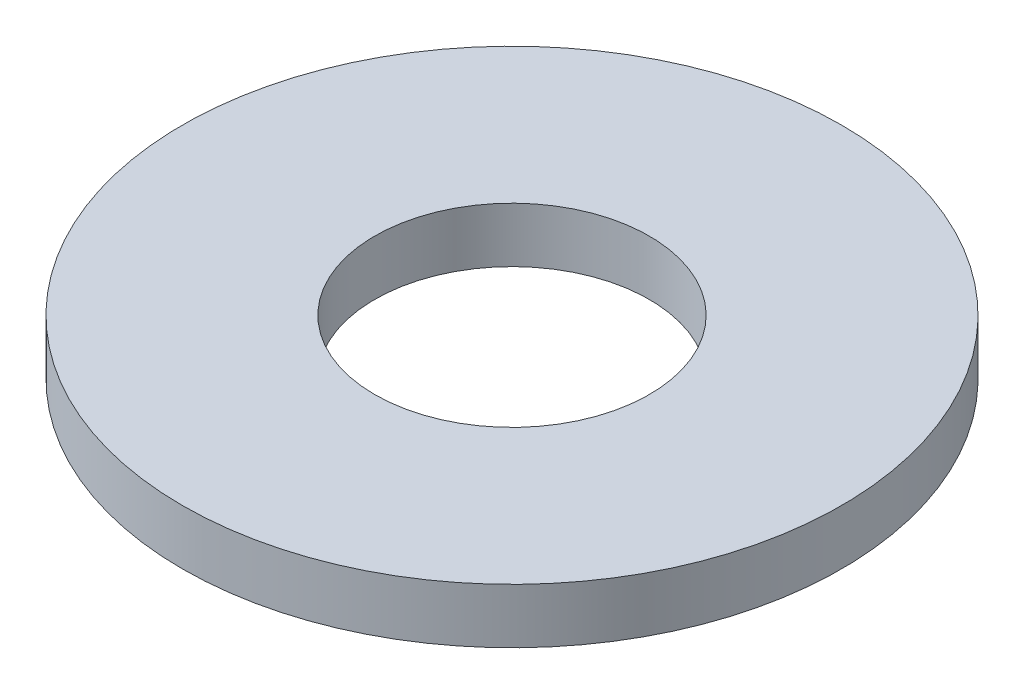
ISO-10303-21;
HEADER;
FILE_DESCRIPTION(('STEP AP214'),'2;1');
FILE_NAME('part.step','',(''),(''),'','','');
FILE_SCHEMA(('AUTOMOTIVE_DESIGN { 1 0 10303 214 1 1 1 1 }'));
ENDSEC;
DATA;
#1=APPLICATION_CONTEXT('core data for automotive mechanical design processes');
#2=APPLICATION_PROTOCOL_DEFINITION('international standard','automotive_design',2000,#1);
#3=PRODUCT_CONTEXT('',#1,'mechanical');
#4=PRODUCT('Part','Part','',(#3));
#5=PRODUCT_RELATED_PRODUCT_CATEGORY('part','',(#4));
#6=PRODUCT_DEFINITION_FORMATION('','',#4);
#7=PRODUCT_DEFINITION_CONTEXT('part definition',#1,'design');
#8=PRODUCT_DEFINITION('design','',#6,#7);
#9=PRODUCT_DEFINITION_SHAPE('','',#8);
#10=(LENGTH_UNIT() NAMED_UNIT(*) SI_UNIT(.MILLI.,.METRE.));
#11=(NAMED_UNIT(*) PLANE_ANGLE_UNIT() SI_UNIT($,.RADIAN.));
#12=(NAMED_UNIT(*) SI_UNIT($,.STERADIAN.) SOLID_ANGLE_UNIT());
#13=UNCERTAINTY_MEASURE_WITH_UNIT(LENGTH_MEASURE(1.E-05),#10,'distance_accuracy_value','');
#14=(GEOMETRIC_REPRESENTATION_CONTEXT(3) GLOBAL_UNCERTAINTY_ASSIGNED_CONTEXT((#13)) GLOBAL_UNIT_ASSIGNED_CONTEXT((#10,
#11,#12)) REPRESENTATION_CONTEXT('',''));
#15=CARTESIAN_POINT('',(0.,0.,0.));
#16=DIRECTION('',(0.,0.,1.));
#17=DIRECTION('',(1.,0.,0.));
#18=AXIS2_PLACEMENT_3D('',#15,#16,#17);
#19=CARTESIAN_POINT('',(0.,1.,0.));
#20=DIRECTION('',(0.,1.,0.));
#21=DIRECTION('',(0.,0.,1.));
#22=AXIS2_PLACEMENT_3D('',#19,#20,#21);
#23=PLANE('',#22);
#24=CARTESIAN_POINT('',(0.,1.,0.));
#25=DIRECTION('',(0.,1.,0.));
#26=DIRECTION('',(0.,0.,1.));
#27=AXIS2_PLACEMENT_3D('',#24,#25,#26);
#28=CIRCLE('',#27,6.);
#29=CARTESIAN_POINT('',(0.,1.,6.));
#30=VERTEX_POINT('',#29);
#31=EDGE_CURVE('E10',#30,#30,#28,.T.);
#32=ORIENTED_EDGE('',*,*,#31,.T.);
#33=EDGE_LOOP('',(#32));
#34=FACE_BOUND('',#33,.T.);
#35=CARTESIAN_POINT('',(0.,1.,0.));
#36=DIRECTION('',(0.,1.,0.));
#37=DIRECTION('',(0.,0.,1.));
#38=AXIS2_PLACEMENT_3D('',#35,#36,#37);
#39=CIRCLE('',#38,2.5);
#40=CARTESIAN_POINT('',(0.,1.,2.5));
#41=VERTEX_POINT('',#40);
#42=EDGE_CURVE('E50',#41,#41,#39,.T.);
#43=ORIENTED_EDGE('',*,*,#42,.F.);
#44=EDGE_LOOP('',(#43));
#45=FACE_BOUND('',#44,.T.);
#46=ADVANCED_FACE('F37',(#34,#45),#23,.T.);
#47=CARTESIAN_POINT('',(0.,0.,0.));
#48=DIRECTION('',(0.,1.,0.));
#49=DIRECTION('',(0.,0.,1.));
#50=AXIS2_PLACEMENT_3D('',#47,#48,#49);
#51=PLANE('',#50);
#52=CARTESIAN_POINT('',(0.,0.,0.));
#53=DIRECTION('',(0.,1.,0.));
#54=DIRECTION('',(0.,0.,1.));
#55=AXIS2_PLACEMENT_3D('',#52,#53,#54);
#56=CIRCLE('',#55,6.);
#57=CARTESIAN_POINT('',(0.,0.,6.));
#58=VERTEX_POINT('',#57);
#59=EDGE_CURVE('E41',#58,#58,#56,.T.);
#60=ORIENTED_EDGE('',*,*,#59,.F.);
#61=EDGE_LOOP('',(#60));
#62=FACE_BOUND('',#61,.T.);
#63=CARTESIAN_POINT('',(0.,0.,0.));
#64=DIRECTION('',(0.,1.,0.));
#65=DIRECTION('',(0.,0.,1.));
#66=AXIS2_PLACEMENT_3D('',#63,#64,#65);
#67=CIRCLE('',#66,2.5);
#68=CARTESIAN_POINT('',(0.,0.,2.5));
#69=VERTEX_POINT('',#68);
#70=EDGE_CURVE('E52',#69,#69,#67,.T.);
#71=ORIENTED_EDGE('',*,*,#70,.T.);
#72=EDGE_LOOP('',(#71));
#73=FACE_BOUND('',#72,.T.);
#74=ADVANCED_FACE('F64',(#62,#73),#51,.F.);
#75=CARTESIAN_POINT('',(0.,1.,0.));
#76=DIRECTION('',(0.,-1.,0.));
#77=DIRECTION('',(0.,0.,-1.));
#78=AXIS2_PLACEMENT_3D('',#75,#76,#77);
#79=CYLINDRICAL_SURFACE('',#78,6.);
#80=ORIENTED_EDGE('',*,*,#31,.F.);
#81=EDGE_LOOP('',(#80));
#82=FACE_BOUND('',#81,.T.);
#83=ORIENTED_EDGE('',*,*,#59,.T.);
#84=EDGE_LOOP('',(#83));
#85=FACE_BOUND('',#84,.T.);
#86=ADVANCED_FACE('F39',(#82,#85),#79,.T.);
#87=CARTESIAN_POINT('',(0.,1.,0.));
#88=DIRECTION('',(0.,-1.,0.));
#89=DIRECTION('',(0.,0.,-1.));
#90=AXIS2_PLACEMENT_3D('',#87,#88,#89);
#91=CYLINDRICAL_SURFACE('',#90,2.5);
#92=ORIENTED_EDGE('',*,*,#42,.T.);
#93=EDGE_LOOP('',(#92));
#94=FACE_BOUND('',#93,.T.);
#95=ORIENTED_EDGE('',*,*,#70,.F.);
#96=EDGE_LOOP('',(#95));
#97=FACE_BOUND('',#96,.T.);
#98=ADVANCED_FACE('F60',(#94,#97),#91,.F.);
#99=CLOSED_SHELL('',(#46,#74,#86,#98));
#100=MANIFOLD_SOLID_BREP('B2',#99);
#101=ADVANCED_BREP_SHAPE_REPRESENTATION('',(#18,#100),#14);
#102=SHAPE_DEFINITION_REPRESENTATION(#9,#101);
ENDSEC;
END-ISO-10303-21;
